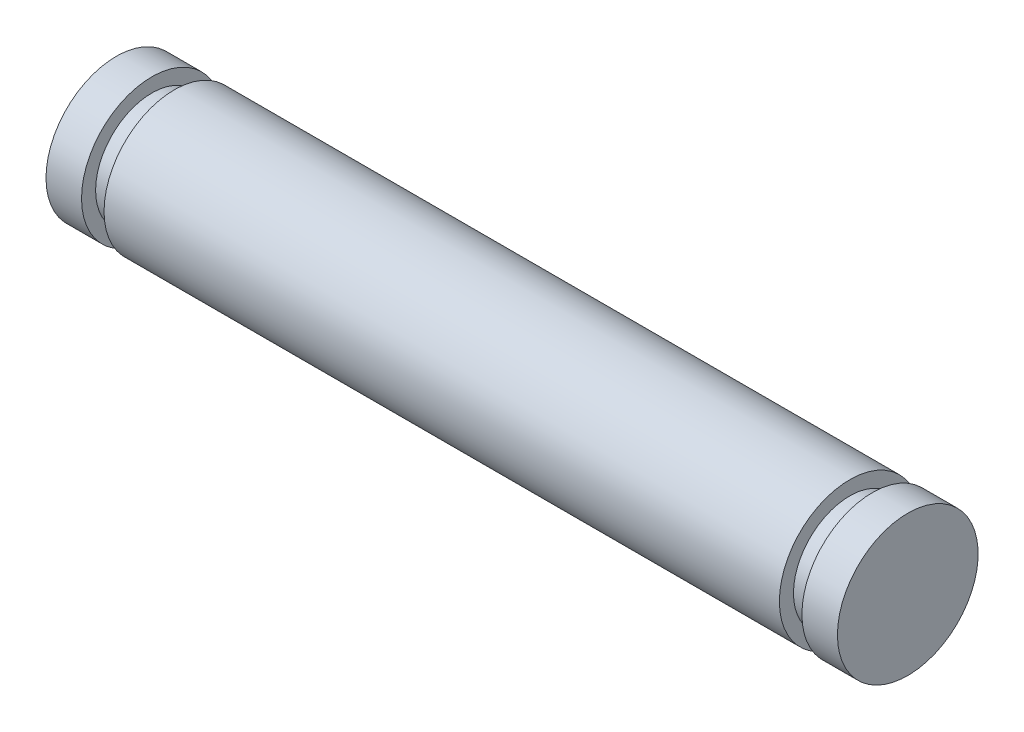
ISO-10303-21;
HEADER;
FILE_DESCRIPTION(('STEP AP214'),'2;1');
FILE_NAME('part.step','',(''),(''),'','','');
FILE_SCHEMA(('AUTOMOTIVE_DESIGN { 1 0 10303 214 1 1 1 1 }'));
ENDSEC;
DATA;
#1=APPLICATION_CONTEXT('core data for automotive mechanical design processes');
#2=APPLICATION_PROTOCOL_DEFINITION('international standard','automotive_design',2000,#1);
#3=PRODUCT_CONTEXT('',#1,'mechanical');
#4=PRODUCT('Part','Part','',(#3));
#5=PRODUCT_RELATED_PRODUCT_CATEGORY('part','',(#4));
#6=PRODUCT_DEFINITION_FORMATION('','',#4);
#7=PRODUCT_DEFINITION_CONTEXT('part definition',#1,'design');
#8=PRODUCT_DEFINITION('design','',#6,#7);
#9=PRODUCT_DEFINITION_SHAPE('','',#8);
#10=(LENGTH_UNIT() NAMED_UNIT(*) SI_UNIT(.MILLI.,.METRE.));
#11=(NAMED_UNIT(*) PLANE_ANGLE_UNIT() SI_UNIT($,.RADIAN.));
#12=(NAMED_UNIT(*) SI_UNIT($,.STERADIAN.) SOLID_ANGLE_UNIT());
#13=UNCERTAINTY_MEASURE_WITH_UNIT(LENGTH_MEASURE(1.E-05),#10,'distance_accuracy_value','');
#14=(GEOMETRIC_REPRESENTATION_CONTEXT(3) GLOBAL_UNCERTAINTY_ASSIGNED_CONTEXT((#13)) GLOBAL_UNIT_ASSIGNED_CONTEXT((#10,
#11,#12)) REPRESENTATION_CONTEXT('',''));
#15=CARTESIAN_POINT('',(0.,0.,0.));
#16=DIRECTION('',(0.,0.,1.));
#17=DIRECTION('',(1.,0.,0.));
#18=AXIS2_PLACEMENT_3D('',#15,#16,#17);
#19=CARTESIAN_POINT('',(11.25,0.,0.));
#20=DIRECTION('',(-1.,0.,0.));
#21=DIRECTION('',(0.,0.,1.));
#22=AXIS2_PLACEMENT_3D('',#19,#20,#21);
#23=CYLINDRICAL_SURFACE('',#22,2.);
#24=CARTESIAN_POINT('',(-9.6,0.,0.));
#25=DIRECTION('',(-1.,0.,0.));
#26=DIRECTION('',(0.,0.,1.));
#27=AXIS2_PLACEMENT_3D('',#24,#25,#26);
#28=CIRCLE('',#27,2.);
#29=CARTESIAN_POINT('',(-9.6,0.,2.));
#30=VERTEX_POINT('',#29);
#31=EDGE_CURVE('E48',#30,#30,#28,.T.);
#32=CARTESIAN_POINT('',(9.6,0.,0.));
#33=DIRECTION('',(-1.,0.,0.));
#34=DIRECTION('',(0.,0.,1.));
#35=AXIS2_PLACEMENT_3D('',#32,#33,#34);
#36=CIRCLE('',#35,2.);
#37=CARTESIAN_POINT('',(9.6,0.,2.));
#38=VERTEX_POINT('',#37);
#39=EDGE_CURVE('E60',#38,#38,#36,.T.);
#40=CARTESIAN_POINT('',(-9.6,0.,2.));
#41=CARTESIAN_POINT('',(-9.4,0.,2.));
#42=CARTESIAN_POINT('',(-9.2,0.,2.));
#43=CARTESIAN_POINT('',(-8.8,0.,2.));
#44=CARTESIAN_POINT('',(-8.6,0.,2.));
#45=CARTESIAN_POINT('',(-8.2,0.,2.));
#46=CARTESIAN_POINT('',(-8.,0.,2.));
#47=CARTESIAN_POINT('',(-7.6,0.,2.));
#48=CARTESIAN_POINT('',(-7.4,0.,2.));
#49=CARTESIAN_POINT('',(-7.,0.,2.));
#50=CARTESIAN_POINT('',(-6.8,0.,2.));
#51=CARTESIAN_POINT('',(-6.4,0.,2.));
#52=CARTESIAN_POINT('',(-6.2,0.,2.));
#53=CARTESIAN_POINT('',(-5.8,0.,2.));
#54=CARTESIAN_POINT('',(-5.6,0.,2.));
#55=CARTESIAN_POINT('',(-5.2,0.,2.));
#56=CARTESIAN_POINT('',(-5.,0.,2.));
#57=CARTESIAN_POINT('',(-4.6,0.,2.));
#58=CARTESIAN_POINT('',(-4.4,0.,2.));
#59=CARTESIAN_POINT('',(-4.,0.,2.));
#60=CARTESIAN_POINT('',(-3.8,0.,2.));
#61=CARTESIAN_POINT('',(-3.4,0.,2.));
#62=CARTESIAN_POINT('',(-3.2,0.,2.));
#63=CARTESIAN_POINT('',(-2.8,0.,2.));
#64=CARTESIAN_POINT('',(-2.6,0.,2.));
#65=CARTESIAN_POINT('',(-2.2,0.,2.));
#66=CARTESIAN_POINT('',(-2.,0.,2.));
#67=CARTESIAN_POINT('',(-1.6,0.,2.));
#68=CARTESIAN_POINT('',(-1.4,0.,2.));
#69=CARTESIAN_POINT('',(-0.999999999999998,0.,2.));
#70=CARTESIAN_POINT('',(-0.799999999999998,0.,2.));
#71=CARTESIAN_POINT('',(-0.399999999999998,0.,2.));
#72=CARTESIAN_POINT('',(-0.199999999999998,0.,2.));
#73=CARTESIAN_POINT('',(0.200000000000002,0.,2.));
#74=CARTESIAN_POINT('',(0.400000000000002,0.,2.));
#75=CARTESIAN_POINT('',(0.800000000000001,0.,2.));
#76=CARTESIAN_POINT('',(1.,0.,2.));
#77=CARTESIAN_POINT('',(1.4,0.,2.));
#78=CARTESIAN_POINT('',(1.6,0.,2.));
#79=CARTESIAN_POINT('',(2.,0.,2.));
#80=CARTESIAN_POINT('',(2.2,0.,2.));
#81=CARTESIAN_POINT('',(2.6,0.,2.));
#82=CARTESIAN_POINT('',(2.8,0.,2.));
#83=CARTESIAN_POINT('',(3.2,0.,2.));
#84=CARTESIAN_POINT('',(3.4,0.,2.));
#85=CARTESIAN_POINT('',(3.8,0.,2.));
#86=CARTESIAN_POINT('',(4.,0.,2.));
#87=CARTESIAN_POINT('',(4.4,0.,2.));
#88=CARTESIAN_POINT('',(4.6,0.,2.));
#89=CARTESIAN_POINT('',(5.,0.,2.));
#90=CARTESIAN_POINT('',(5.2,0.,2.));
#91=CARTESIAN_POINT('',(5.6,0.,2.));
#92=CARTESIAN_POINT('',(5.8,0.,2.));
#93=CARTESIAN_POINT('',(6.2,0.,2.));
#94=CARTESIAN_POINT('',(6.4,0.,2.));
#95=CARTESIAN_POINT('',(6.8,0.,2.));
#96=CARTESIAN_POINT('',(7.,0.,2.));
#97=CARTESIAN_POINT('',(7.4,0.,2.));
#98=CARTESIAN_POINT('',(7.6,0.,2.));
#99=CARTESIAN_POINT('',(8.,0.,2.));
#100=CARTESIAN_POINT('',(8.2,0.,2.));
#101=CARTESIAN_POINT('',(8.6,0.,2.));
#102=CARTESIAN_POINT('',(8.8,0.,2.));
#103=CARTESIAN_POINT('',(9.2,0.,2.));
#104=CARTESIAN_POINT('',(9.4,0.,2.));
#105=CARTESIAN_POINT('',(9.6,0.,2.));
#106=B_SPLINE_CURVE_WITH_KNOTS('',3,(#40,#41,#42,#43,#44,#45,#46,#47,#48,#49,#50,#51,#52,#53,
#54,#55,#56,#57,#58,#59,#60,#61,#62,#63,#64,#65,#66,#67,#68,#69,#70,#71,#72,#73,#74,#75,#76,#77,
#78,#79,#80,#81,#82,#83,#84,#85,#86,#87,#88,#89,#90,#91,#92,#93,#94,#95,#96,#97,#98,#99,#100,
#101,#102,#103,#104,#105),.UNSPECIFIED.,.F.,.F.,(4,2,2,2,2,2,2,2,2,2,2,2,2,2,2,2,2,2,2,2,2,2,2,
2,2,2,2,2,2,2,2,2,4),(0.,0.6,1.2,1.8,2.4,3.,3.6,4.2,4.8,5.4,6.,6.6,7.2,7.8,8.4,9.,9.6,10.2,10.8,
11.4,12.,12.6,13.2,13.8,14.4,15.,15.6,16.2,16.8,17.4,18.,18.6,19.2),.UNSPECIFIED.);
#107=EDGE_CURVE('BSEAM30',#30,#38,#106,.T.);
#108=ORIENTED_EDGE('',*,*,#31,.F.);
#109=ORIENTED_EDGE('',*,*,#39,.T.);
#110=ORIENTED_EDGE('',*,*,#107,.T.);
#111=ORIENTED_EDGE('',*,*,#107,.F.);
#112=EDGE_LOOP('',(#108,#110,#109,#111));
#113=FACE_BOUND('',#112,.T.);
#114=ADVANCED_FACE('F30',(#113),#23,.T.);
#115=CARTESIAN_POINT('',(-11.25,0.,0.));
#116=DIRECTION('',(1.,0.,0.));
#117=DIRECTION('',(0.,0.,-1.));
#118=AXIS2_PLACEMENT_3D('',#115,#116,#117);
#119=CIRCLE('',#118,2.);
#120=CARTESIAN_POINT('',(-11.25,0.,2.));
#121=VERTEX_POINT('',#120);
#122=EDGE_CURVE('E34',#121,#121,#119,.T.);
#123=CARTESIAN_POINT('',(-10.24,0.,0.));
#124=DIRECTION('',(-1.,0.,0.));
#125=DIRECTION('',(0.,0.,1.));
#126=AXIS2_PLACEMENT_3D('',#123,#124,#125);
#127=CIRCLE('',#126,2.);
#128=CARTESIAN_POINT('',(-10.24,0.,2.));
#129=VERTEX_POINT('',#128);
#130=EDGE_CURVE('E51',#129,#129,#127,.T.);
#131=CARTESIAN_POINT('',(-11.25,0.,2.));
#132=CARTESIAN_POINT('',(-11.2394791666667,0.,2.));
#133=CARTESIAN_POINT('',(-11.2289583333333,0.,2.));
#134=CARTESIAN_POINT('',(-11.2079166666667,0.,2.));
#135=CARTESIAN_POINT('',(-11.1973958333333,0.,2.));
#136=CARTESIAN_POINT('',(-11.1763541666667,0.,2.));
#137=CARTESIAN_POINT('',(-11.1658333333333,0.,2.));
#138=CARTESIAN_POINT('',(-11.1447916666667,0.,2.));
#139=CARTESIAN_POINT('',(-11.1342708333333,0.,2.));
#140=CARTESIAN_POINT('',(-11.1132291666667,0.,2.));
#141=CARTESIAN_POINT('',(-11.1027083333333,0.,2.));
#142=CARTESIAN_POINT('',(-11.0816666666667,0.,2.));
#143=CARTESIAN_POINT('',(-11.0711458333333,0.,2.));
#144=CARTESIAN_POINT('',(-11.0501041666667,0.,2.));
#145=CARTESIAN_POINT('',(-11.0395833333333,0.,2.));
#146=CARTESIAN_POINT('',(-11.0185416666667,0.,2.));
#147=CARTESIAN_POINT('',(-11.0080208333333,0.,2.));
#148=CARTESIAN_POINT('',(-10.9869791666667,0.,2.));
#149=CARTESIAN_POINT('',(-10.9764583333333,0.,2.));
#150=CARTESIAN_POINT('',(-10.9554166666667,0.,2.));
#151=CARTESIAN_POINT('',(-10.9448958333333,0.,2.));
#152=CARTESIAN_POINT('',(-10.9238541666667,0.,2.));
#153=CARTESIAN_POINT('',(-10.9133333333333,0.,2.));
#154=CARTESIAN_POINT('',(-10.8922916666667,0.,2.));
#155=CARTESIAN_POINT('',(-10.8817708333333,0.,2.));
#156=CARTESIAN_POINT('',(-10.8607291666667,0.,2.));
#157=CARTESIAN_POINT('',(-10.8502083333333,0.,2.));
#158=CARTESIAN_POINT('',(-10.8291666666667,0.,2.));
#159=CARTESIAN_POINT('',(-10.8186458333333,0.,2.));
#160=CARTESIAN_POINT('',(-10.7976041666667,0.,2.));
#161=CARTESIAN_POINT('',(-10.7870833333333,0.,2.));
#162=CARTESIAN_POINT('',(-10.7660416666667,0.,2.));
#163=CARTESIAN_POINT('',(-10.7555208333333,0.,2.));
#164=CARTESIAN_POINT('',(-10.7344791666667,0.,2.));
#165=CARTESIAN_POINT('',(-10.7239583333333,0.,2.));
#166=CARTESIAN_POINT('',(-10.7029166666667,0.,2.));
#167=CARTESIAN_POINT('',(-10.6923958333333,0.,2.));
#168=CARTESIAN_POINT('',(-10.6713541666667,0.,2.));
#169=CARTESIAN_POINT('',(-10.6608333333333,0.,2.));
#170=CARTESIAN_POINT('',(-10.6397916666667,0.,2.));
#171=CARTESIAN_POINT('',(-10.6292708333333,0.,2.));
#172=CARTESIAN_POINT('',(-10.6082291666667,0.,2.));
#173=CARTESIAN_POINT('',(-10.5977083333333,0.,2.));
#174=CARTESIAN_POINT('',(-10.5766666666667,0.,2.));
#175=CARTESIAN_POINT('',(-10.5661458333333,0.,2.));
#176=CARTESIAN_POINT('',(-10.5451041666667,0.,2.));
#177=CARTESIAN_POINT('',(-10.5345833333333,0.,2.));
#178=CARTESIAN_POINT('',(-10.5135416666667,0.,2.));
#179=CARTESIAN_POINT('',(-10.5030208333333,0.,2.));
#180=CARTESIAN_POINT('',(-10.4819791666667,0.,2.));
#181=CARTESIAN_POINT('',(-10.4714583333333,0.,2.));
#182=CARTESIAN_POINT('',(-10.4504166666667,0.,2.));
#183=CARTESIAN_POINT('',(-10.4398958333333,0.,2.));
#184=CARTESIAN_POINT('',(-10.4188541666667,0.,2.));
#185=CARTESIAN_POINT('',(-10.4083333333333,0.,2.));
#186=CARTESIAN_POINT('',(-10.3872916666667,0.,2.));
#187=CARTESIAN_POINT('',(-10.3767708333333,0.,2.));
#188=CARTESIAN_POINT('',(-10.3557291666667,0.,2.));
#189=CARTESIAN_POINT('',(-10.3452083333333,0.,2.));
#190=CARTESIAN_POINT('',(-10.3241666666667,0.,2.));
#191=CARTESIAN_POINT('',(-10.3136458333333,0.,2.));
#192=CARTESIAN_POINT('',(-10.2926041666667,0.,2.));
#193=CARTESIAN_POINT('',(-10.2820833333333,0.,2.));
#194=CARTESIAN_POINT('',(-10.2610416666667,0.,2.));
#195=CARTESIAN_POINT('',(-10.2505208333333,0.,2.));
#196=CARTESIAN_POINT('',(-10.24,0.,2.));
#197=B_SPLINE_CURVE_WITH_KNOTS('',3,(#131,#132,#133,#134,#135,#136,#137,#138,#139,#140,#141,
#142,#143,#144,#145,#146,#147,#148,#149,#150,#151,#152,#153,#154,#155,#156,#157,#158,#159,#160,
#161,#162,#163,#164,#165,#166,#167,#168,#169,#170,#171,#172,#173,#174,#175,#176,#177,#178,#179,
#180,#181,#182,#183,#184,#185,#186,#187,#188,#189,#190,#191,#192,#193,#194,#195,#196),
.UNSPECIFIED.,.F.,.F.,(4,2,2,2,2,2,2,2,2,2,2,2,2,2,2,2,2,2,2,2,2,2,2,2,2,2,2,2,2,2,2,2,4),(0.,
0.0315624999999986,0.0631250000000007,0.0946874999999993,0.126250000000001,0.1578125,
0.189375000000002,0.220937500000001,0.252500000000003,0.284062500000001,0.315625,
0.347187500000002,0.378750000000001,0.410312500000003,0.441875000000001,0.473437500000003,
0.505000000000002,0.536562500000001,0.568125000000003,0.599687500000001,0.631250000000003,
0.662812500000002,0.694375000000004,0.725937500000003,0.757500000000001,0.789062500000003,
0.820625000000002,0.852187500000004,0.883750000000003,0.915312500000005,0.946875000000003,
0.978437500000005,1.01),.UNSPECIFIED.);
#198=EDGE_CURVE('BSEAM32',#121,#129,#197,.T.);
#199=ORIENTED_EDGE('',*,*,#122,.T.);
#200=ORIENTED_EDGE('',*,*,#130,.T.);
#201=ORIENTED_EDGE('',*,*,#198,.T.);
#202=ORIENTED_EDGE('',*,*,#198,.F.);
#203=EDGE_LOOP('',(#199,#201,#200,#202));
#204=FACE_BOUND('',#203,.T.);
#205=ADVANCED_FACE('F32',(#204),#23,.T.);
#206=CARTESIAN_POINT('',(-11.25,0.,0.));
#207=DIRECTION('',(1.,0.,0.));
#208=DIRECTION('',(0.,0.,-1.));
#209=AXIS2_PLACEMENT_3D('',#206,#207,#208);
#210=PLANE('',#209);
#211=ORIENTED_EDGE('',*,*,#122,.F.);
#212=EDGE_LOOP('',(#211));
#213=FACE_BOUND('',#212,.T.);
#214=ADVANCED_FACE('F81',(#213),#210,.F.);
#215=CARTESIAN_POINT('',(-10.24,0.,-2.));
#216=DIRECTION('',(1.,0.,0.));
#217=DIRECTION('',(0.,0.,-1.));
#218=AXIS2_PLACEMENT_3D('',#215,#216,#217);
#219=PLANE('',#218);
#220=CARTESIAN_POINT('',(-10.24,0.,0.));
#221=DIRECTION('',(-1.,0.,0.));
#222=DIRECTION('',(0.,0.,1.));
#223=AXIS2_PLACEMENT_3D('',#220,#221,#222);
#224=CIRCLE('',#223,1.6);
#225=CARTESIAN_POINT('',(-10.24,0.,1.6));
#226=VERTEX_POINT('',#225);
#227=EDGE_CURVE('E41',#226,#226,#224,.T.);
#228=ORIENTED_EDGE('',*,*,#227,.T.);
#229=EDGE_LOOP('',(#228));
#230=FACE_BOUND('',#229,.T.);
#231=ORIENTED_EDGE('',*,*,#130,.F.);
#232=EDGE_LOOP('',(#231));
#233=FACE_BOUND('',#232,.T.);
#234=ADVANCED_FACE('F86',(#230,#233),#219,.T.);
#235=CARTESIAN_POINT('',(-12.375,0.,0.));
#236=DIRECTION('',(-1.,0.,0.));
#237=DIRECTION('',(0.,0.,1.));
#238=AXIS2_PLACEMENT_3D('',#235,#236,#237);
#239=CYLINDRICAL_SURFACE('',#238,1.6);
#240=CARTESIAN_POINT('',(-9.6,0.,0.));
#241=DIRECTION('',(-1.,0.,0.));
#242=DIRECTION('',(0.,0.,1.));
#243=AXIS2_PLACEMENT_3D('',#240,#241,#242);
#244=CIRCLE('',#243,1.6);
#245=CARTESIAN_POINT('',(-9.6,0.,1.6));
#246=VERTEX_POINT('',#245);
#247=EDGE_CURVE('E45',#246,#246,#244,.T.);
#248=ORIENTED_EDGE('',*,*,#247,.T.);
#249=EDGE_LOOP('',(#248));
#250=FACE_BOUND('',#249,.T.);
#251=ORIENTED_EDGE('',*,*,#227,.F.);
#252=EDGE_LOOP('',(#251));
#253=FACE_BOUND('',#252,.T.);
#254=ADVANCED_FACE('F93',(#250,#253),#239,.T.);
#255=CARTESIAN_POINT('',(-9.6,0.,-2.));
#256=DIRECTION('',(-1.,0.,0.));
#257=DIRECTION('',(0.,0.,1.));
#258=AXIS2_PLACEMENT_3D('',#255,#256,#257);
#259=PLANE('',#258);
#260=ORIENTED_EDGE('',*,*,#31,.T.);
#261=EDGE_LOOP('',(#260));
#262=FACE_BOUND('',#261,.T.);
#263=ORIENTED_EDGE('',*,*,#247,.F.);
#264=EDGE_LOOP('',(#263));
#265=FACE_BOUND('',#264,.T.);
#266=ADVANCED_FACE('F99',(#262,#265),#259,.T.);
#267=CARTESIAN_POINT('',(10.24,0.,-2.));
#268=DIRECTION('',(-1.,0.,0.));
#269=DIRECTION('',(0.,0.,-1.));
#270=AXIS2_PLACEMENT_3D('',#267,#268,#269);
#271=PLANE('',#270);
#272=CARTESIAN_POINT('',(10.24,0.,0.));
#273=DIRECTION('',(-1.,0.,0.));
#274=DIRECTION('',(0.,0.,1.));
#275=AXIS2_PLACEMENT_3D('',#272,#273,#274);
#276=CIRCLE('',#275,1.6);
#277=CARTESIAN_POINT('',(10.24,0.,1.6));
#278=VERTEX_POINT('',#277);
#279=EDGE_CURVE('E54',#278,#278,#276,.T.);
#280=ORIENTED_EDGE('',*,*,#279,.F.);
#281=EDGE_LOOP('',(#280));
#282=FACE_BOUND('',#281,.T.);
#283=CARTESIAN_POINT('',(10.24,0.,0.));
#284=DIRECTION('',(-1.,0.,0.));
#285=DIRECTION('',(0.,0.,1.));
#286=AXIS2_PLACEMENT_3D('',#283,#284,#285);
#287=CIRCLE('',#286,2.);
#288=CARTESIAN_POINT('',(10.24,0.,2.));
#289=VERTEX_POINT('',#288);
#290=EDGE_CURVE('E63',#289,#289,#287,.T.);
#291=ORIENTED_EDGE('',*,*,#290,.T.);
#292=EDGE_LOOP('',(#291));
#293=FACE_BOUND('',#292,.T.);
#294=ADVANCED_FACE('F67',(#282,#293),#271,.T.);
#295=CARTESIAN_POINT('',(12.375,0.,0.));
#296=DIRECTION('',(1.,0.,0.));
#297=DIRECTION('',(0.,0.,1.));
#298=AXIS2_PLACEMENT_3D('',#295,#296,#297);
#299=CYLINDRICAL_SURFACE('',#298,1.6);
#300=CARTESIAN_POINT('',(9.6,0.,0.));
#301=DIRECTION('',(-1.,0.,0.));
#302=DIRECTION('',(0.,0.,1.));
#303=AXIS2_PLACEMENT_3D('',#300,#301,#302);
#304=CIRCLE('',#303,1.6);
#305=CARTESIAN_POINT('',(9.6,0.,1.6));
#306=VERTEX_POINT('',#305);
#307=EDGE_CURVE('E57',#306,#306,#304,.T.);
#308=ORIENTED_EDGE('',*,*,#307,.F.);
#309=EDGE_LOOP('',(#308));
#310=FACE_BOUND('',#309,.T.);
#311=ORIENTED_EDGE('',*,*,#279,.T.);
#312=EDGE_LOOP('',(#311));
#313=FACE_BOUND('',#312,.T.);
#314=ADVANCED_FACE('F108',(#310,#313),#299,.T.);
#315=CARTESIAN_POINT('',(9.6,0.,-2.));
#316=DIRECTION('',(1.,0.,0.));
#317=DIRECTION('',(0.,0.,1.));
#318=AXIS2_PLACEMENT_3D('',#315,#316,#317);
#319=PLANE('',#318);
#320=ORIENTED_EDGE('',*,*,#39,.F.);
#321=EDGE_LOOP('',(#320));
#322=FACE_BOUND('',#321,.T.);
#323=ORIENTED_EDGE('',*,*,#307,.T.);
#324=EDGE_LOOP('',(#323));
#325=FACE_BOUND('',#324,.T.);
#326=ADVANCED_FACE('F76',(#322,#325),#319,.T.);
#327=CARTESIAN_POINT('',(11.25,0.,0.));
#328=DIRECTION('',(1.,0.,0.));
#329=DIRECTION('',(0.,0.,-1.));
#330=AXIS2_PLACEMENT_3D('',#327,#328,#329);
#331=PLANE('',#330);
#332=CARTESIAN_POINT('',(11.25,0.,0.));
#333=DIRECTION('',(1.,0.,0.));
#334=DIRECTION('',(0.,0.,-1.));
#335=AXIS2_PLACEMENT_3D('',#332,#333,#334);
#336=CIRCLE('',#335,2.);
#337=CARTESIAN_POINT('',(11.25,0.,2.));
#338=VERTEX_POINT('',#337);
#339=EDGE_CURVE('E10',#338,#338,#336,.T.);
#340=ORIENTED_EDGE('',*,*,#339,.T.);
#341=EDGE_LOOP('',(#340));
#342=FACE_BOUND('',#341,.T.);
#343=ADVANCED_FACE('F71',(#342),#331,.T.);
#344=CARTESIAN_POINT('',(11.25,0.,2.));
#345=CARTESIAN_POINT('',(11.2394791666667,0.,2.));
#346=CARTESIAN_POINT('',(11.2289583333333,0.,2.));
#347=CARTESIAN_POINT('',(11.2079166666667,0.,2.));
#348=CARTESIAN_POINT('',(11.1973958333333,0.,2.));
#349=CARTESIAN_POINT('',(11.1763541666667,0.,2.));
#350=CARTESIAN_POINT('',(11.1658333333333,0.,2.));
#351=CARTESIAN_POINT('',(11.1447916666667,0.,2.));
#352=CARTESIAN_POINT('',(11.1342708333333,0.,2.));
#353=CARTESIAN_POINT('',(11.1132291666667,0.,2.));
#354=CARTESIAN_POINT('',(11.1027083333333,0.,2.));
#355=CARTESIAN_POINT('',(11.0816666666667,0.,2.));
#356=CARTESIAN_POINT('',(11.0711458333333,0.,2.));
#357=CARTESIAN_POINT('',(11.0501041666667,0.,2.));
#358=CARTESIAN_POINT('',(11.0395833333333,0.,2.));
#359=CARTESIAN_POINT('',(11.0185416666667,0.,2.));
#360=CARTESIAN_POINT('',(11.0080208333333,0.,2.));
#361=CARTESIAN_POINT('',(10.9869791666667,0.,2.));
#362=CARTESIAN_POINT('',(10.9764583333333,0.,2.));
#363=CARTESIAN_POINT('',(10.9554166666667,0.,2.));
#364=CARTESIAN_POINT('',(10.9448958333333,0.,2.));
#365=CARTESIAN_POINT('',(10.9238541666667,0.,2.));
#366=CARTESIAN_POINT('',(10.9133333333333,0.,2.));
#367=CARTESIAN_POINT('',(10.8922916666667,0.,2.));
#368=CARTESIAN_POINT('',(10.8817708333333,0.,2.));
#369=CARTESIAN_POINT('',(10.8607291666667,0.,2.));
#370=CARTESIAN_POINT('',(10.8502083333333,0.,2.));
#371=CARTESIAN_POINT('',(10.8291666666667,0.,2.));
#372=CARTESIAN_POINT('',(10.8186458333333,0.,2.));
#373=CARTESIAN_POINT('',(10.7976041666667,0.,2.));
#374=CARTESIAN_POINT('',(10.7870833333333,0.,2.));
#375=CARTESIAN_POINT('',(10.7660416666667,0.,2.));
#376=CARTESIAN_POINT('',(10.7555208333333,0.,2.));
#377=CARTESIAN_POINT('',(10.7344791666667,0.,2.));
#378=CARTESIAN_POINT('',(10.7239583333333,0.,2.));
#379=CARTESIAN_POINT('',(10.7029166666667,0.,2.));
#380=CARTESIAN_POINT('',(10.6923958333333,0.,2.));
#381=CARTESIAN_POINT('',(10.6713541666667,0.,2.));
#382=CARTESIAN_POINT('',(10.6608333333333,0.,2.));
#383=CARTESIAN_POINT('',(10.6397916666667,0.,2.));
#384=CARTESIAN_POINT('',(10.6292708333333,0.,2.));
#385=CARTESIAN_POINT('',(10.6082291666667,0.,2.));
#386=CARTESIAN_POINT('',(10.5977083333333,0.,2.));
#387=CARTESIAN_POINT('',(10.5766666666667,0.,2.));
#388=CARTESIAN_POINT('',(10.5661458333333,0.,2.));
#389=CARTESIAN_POINT('',(10.5451041666667,0.,2.));
#390=CARTESIAN_POINT('',(10.5345833333333,0.,2.));
#391=CARTESIAN_POINT('',(10.5135416666667,0.,2.));
#392=CARTESIAN_POINT('',(10.5030208333333,0.,2.));
#393=CARTESIAN_POINT('',(10.4819791666667,0.,2.));
#394=CARTESIAN_POINT('',(10.4714583333333,0.,2.));
#395=CARTESIAN_POINT('',(10.4504166666667,0.,2.));
#396=CARTESIAN_POINT('',(10.4398958333333,0.,2.));
#397=CARTESIAN_POINT('',(10.4188541666667,0.,2.));
#398=CARTESIAN_POINT('',(10.4083333333333,0.,2.));
#399=CARTESIAN_POINT('',(10.3872916666667,0.,2.));
#400=CARTESIAN_POINT('',(10.3767708333333,0.,2.));
#401=CARTESIAN_POINT('',(10.3557291666667,0.,2.));
#402=CARTESIAN_POINT('',(10.3452083333333,0.,2.));
#403=CARTESIAN_POINT('',(10.3241666666667,0.,2.));
#404=CARTESIAN_POINT('',(10.3136458333333,0.,2.));
#405=CARTESIAN_POINT('',(10.2926041666667,0.,2.));
#406=CARTESIAN_POINT('',(10.2820833333333,0.,2.));
#407=CARTESIAN_POINT('',(10.2610416666667,0.,2.));
#408=CARTESIAN_POINT('',(10.2505208333333,0.,2.));
#409=CARTESIAN_POINT('',(10.24,0.,2.));
#410=B_SPLINE_CURVE_WITH_KNOTS('',3,(#344,#345,#346,#347,#348,#349,#350,#351,#352,#353,#354,
#355,#356,#357,#358,#359,#360,#361,#362,#363,#364,#365,#366,#367,#368,#369,#370,#371,#372,#373,
#374,#375,#376,#377,#378,#379,#380,#381,#382,#383,#384,#385,#386,#387,#388,#389,#390,#391,#392,
#393,#394,#395,#396,#397,#398,#399,#400,#401,#402,#403,#404,#405,#406,#407,#408,#409),
.UNSPECIFIED.,.F.,.F.,(4,2,2,2,2,2,2,2,2,2,2,2,2,2,2,2,2,2,2,2,2,2,2,2,2,2,2,2,2,2,2,2,4),(0.,
0.0315624999999986,0.0631249999999989,0.0946874999999993,0.12625,0.157812499999998,
0.189374999999999,0.220937499999999,0.252499999999999,0.2840625,0.315624999999998,
0.347187499999999,0.378749999999999,0.410312499999999,0.441874999999998,0.473437499999998,
0.504999999999999,0.536562499999999,0.568124999999997,0.599687499999998,0.631249999999998,
0.662812499999998,0.694374999999999,0.725937499999997,0.757499999999998,0.789062499999998,
0.820624999999998,0.852187499999999,0.883749999999997,0.915312499999998,0.946874999999998,
0.978437499999998,1.01),.UNSPECIFIED.);
#411=EDGE_CURVE('BSEAM69',#338,#289,#410,.T.);
#412=ORIENTED_EDGE('',*,*,#339,.F.);
#413=ORIENTED_EDGE('',*,*,#290,.F.);
#414=ORIENTED_EDGE('',*,*,#411,.T.);
#415=ORIENTED_EDGE('',*,*,#411,.F.);
#416=EDGE_LOOP('',(#412,#414,#413,#415));
#417=FACE_BOUND('',#416,.T.);
#418=ADVANCED_FACE('F69',(#417),#23,.T.);
#419=CLOSED_SHELL('',(#114,#205,#214,#234,#254,#266,#294,#314,#326,#343,#418));
#420=MANIFOLD_SOLID_BREP('B2',#419);
#421=ADVANCED_BREP_SHAPE_REPRESENTATION('',(#18,#420),#14);
#422=SHAPE_DEFINITION_REPRESENTATION(#9,#421);
ENDSEC;
END-ISO-10303-21;
